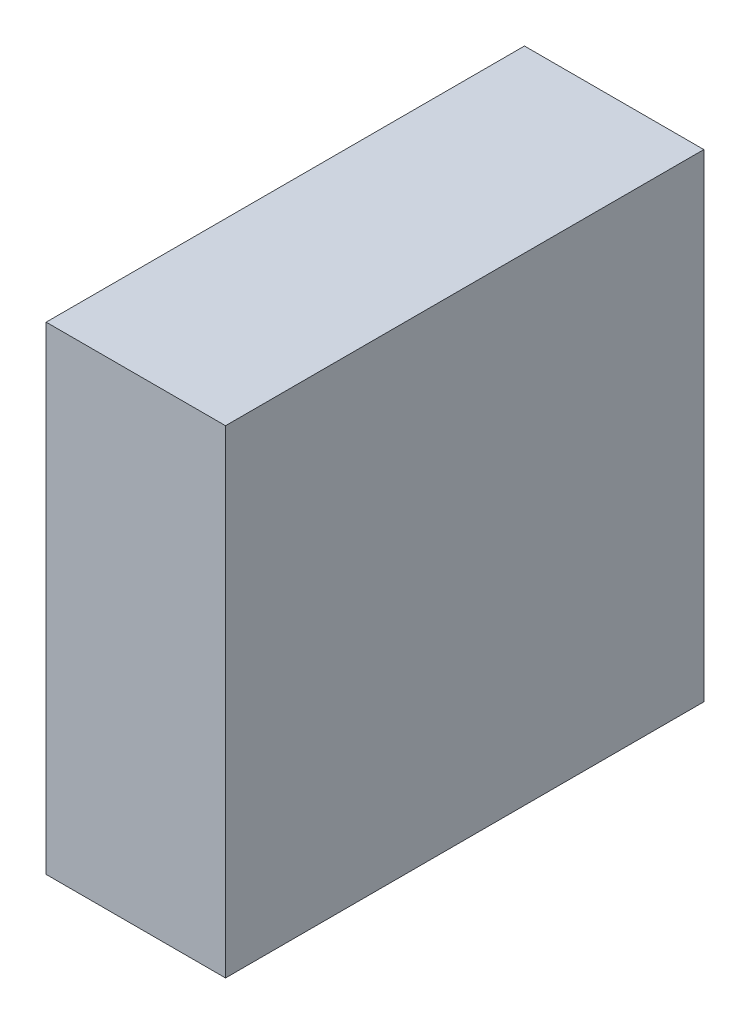
ISO-10303-21;
HEADER;
FILE_DESCRIPTION(('STEP AP214'),'2;1');
FILE_NAME('part.step','',(''),(''),'','','');
FILE_SCHEMA(('AUTOMOTIVE_DESIGN { 1 0 10303 214 1 1 1 1 }'));
ENDSEC;
DATA;
#1=APPLICATION_CONTEXT('core data for automotive mechanical design processes');
#2=APPLICATION_PROTOCOL_DEFINITION('international standard','automotive_design',2000,#1);
#3=PRODUCT_CONTEXT('',#1,'mechanical');
#4=PRODUCT('Part','Part','',(#3));
#5=PRODUCT_RELATED_PRODUCT_CATEGORY('part','',(#4));
#6=PRODUCT_DEFINITION_FORMATION('','',#4);
#7=PRODUCT_DEFINITION_CONTEXT('part definition',#1,'design');
#8=PRODUCT_DEFINITION('design','',#6,#7);
#9=PRODUCT_DEFINITION_SHAPE('','',#8);
#10=(LENGTH_UNIT() NAMED_UNIT(*) SI_UNIT(.MILLI.,.METRE.));
#11=(NAMED_UNIT(*) PLANE_ANGLE_UNIT() SI_UNIT($,.RADIAN.));
#12=(NAMED_UNIT(*) SI_UNIT($,.STERADIAN.) SOLID_ANGLE_UNIT());
#13=UNCERTAINTY_MEASURE_WITH_UNIT(LENGTH_MEASURE(1.E-05),#10,'distance_accuracy_value','');
#14=(GEOMETRIC_REPRESENTATION_CONTEXT(3) GLOBAL_UNCERTAINTY_ASSIGNED_CONTEXT((#13)) GLOBAL_UNIT_ASSIGNED_CONTEXT((#10,
#11,#12)) REPRESENTATION_CONTEXT('',''));
#15=CARTESIAN_POINT('',(0.,0.,0.));
#16=DIRECTION('',(0.,0.,1.));
#17=DIRECTION('',(1.,0.,0.));
#18=AXIS2_PLACEMENT_3D('',#15,#16,#17);
#19=CARTESIAN_POINT('',(0.,25.4,0.));
#20=DIRECTION('',(0.,0.,-1.));
#21=DIRECTION('',(-1.,0.,0.));
#22=AXIS2_PLACEMENT_3D('',#19,#20,#21);
#23=PLANE('',#22);
#24=DIRECTION('',(1.,0.,0.));
#25=VECTOR('',#24,1.);
#26=CARTESIAN_POINT('',(0.,0.,0.));
#27=LINE('',#26,#25);
#28=CARTESIAN_POINT('',(0.,0.,0.));
#29=VERTEX_POINT('',#28);
#30=CARTESIAN_POINT('',(9.525,0.,0.));
#31=VERTEX_POINT('',#30);
#32=EDGE_CURVE('E98',#29,#31,#27,.T.);
#33=ORIENTED_EDGE('',*,*,#32,.T.);
#34=DIRECTION('',(0.,-1.,0.));
#35=VECTOR('',#34,1.);
#36=CARTESIAN_POINT('',(9.525,25.4,0.));
#37=LINE('',#36,#35);
#38=CARTESIAN_POINT('',(9.525,25.4,0.));
#39=VERTEX_POINT('',#38);
#40=EDGE_CURVE('E11',#39,#31,#37,.T.);
#41=ORIENTED_EDGE('',*,*,#40,.F.);
#42=DIRECTION('',(1.,0.,0.));
#43=VECTOR('',#42,1.);
#44=CARTESIAN_POINT('',(0.,25.4,0.));
#45=LINE('',#44,#43);
#46=CARTESIAN_POINT('',(0.,25.4,0.));
#47=VERTEX_POINT('',#46);
#48=EDGE_CURVE('E84',#47,#39,#45,.T.);
#49=ORIENTED_EDGE('',*,*,#48,.F.);
#50=DIRECTION('',(0.,-1.,0.));
#51=VECTOR('',#50,1.);
#52=CARTESIAN_POINT('',(0.,25.4,0.));
#53=LINE('',#52,#51);
#54=EDGE_CURVE('E51',#47,#29,#53,.T.);
#55=ORIENTED_EDGE('',*,*,#54,.T.);
#56=EDGE_LOOP('',(#33,#41,#49,#55));
#57=FACE_BOUND('',#56,.T.);
#58=ADVANCED_FACE('F35',(#57),#23,.F.);
#59=CARTESIAN_POINT('',(9.525,25.4,0.));
#60=DIRECTION('',(-1.,0.,0.));
#61=DIRECTION('',(0.,0.,1.));
#62=AXIS2_PLACEMENT_3D('',#59,#60,#61);
#63=PLANE('',#62);
#64=DIRECTION('',(0.,0.,-1.));
#65=VECTOR('',#64,1.);
#66=CARTESIAN_POINT('',(9.525,0.,0.));
#67=LINE('',#66,#65);
#68=CARTESIAN_POINT('',(9.525,0.,-25.4));
#69=VERTEX_POINT('',#68);
#70=EDGE_CURVE('E89',#31,#69,#67,.T.);
#71=ORIENTED_EDGE('',*,*,#70,.T.);
#72=DIRECTION('',(0.,-1.,0.));
#73=VECTOR('',#72,1.);
#74=CARTESIAN_POINT('',(9.525,25.4,-25.4));
#75=LINE('',#74,#73);
#76=CARTESIAN_POINT('',(9.525,25.4,-25.4));
#77=VERTEX_POINT('',#76);
#78=EDGE_CURVE('E43',#77,#69,#75,.T.);
#79=ORIENTED_EDGE('',*,*,#78,.F.);
#80=DIRECTION('',(0.,0.,-1.));
#81=VECTOR('',#80,1.);
#82=CARTESIAN_POINT('',(9.525,25.4,0.));
#83=LINE('',#82,#81);
#84=EDGE_CURVE('E76',#39,#77,#83,.T.);
#85=ORIENTED_EDGE('',*,*,#84,.F.);
#86=ORIENTED_EDGE('',*,*,#40,.T.);
#87=EDGE_LOOP('',(#71,#79,#85,#86));
#88=FACE_BOUND('',#87,.T.);
#89=ADVANCED_FACE('F88',(#88),#63,.F.);
#90=CARTESIAN_POINT('',(0.,25.4,-25.4));
#91=DIRECTION('',(0.,0.,-1.));
#92=DIRECTION('',(-1.,0.,0.));
#93=AXIS2_PLACEMENT_3D('',#90,#91,#92);
#94=PLANE('',#93);
#95=DIRECTION('',(1.,0.,0.));
#96=VECTOR('',#95,1.);
#97=CARTESIAN_POINT('',(0.,0.,-25.4));
#98=LINE('',#97,#96);
#99=CARTESIAN_POINT('',(0.,0.,-25.4));
#100=VERTEX_POINT('',#99);
#101=EDGE_CURVE('E102',#100,#69,#98,.T.);
#102=ORIENTED_EDGE('',*,*,#101,.F.);
#103=DIRECTION('',(0.,-1.,0.));
#104=VECTOR('',#103,1.);
#105=CARTESIAN_POINT('',(0.,25.4,-25.4));
#106=LINE('',#105,#104);
#107=CARTESIAN_POINT('',(0.,25.4,-25.4));
#108=VERTEX_POINT('',#107);
#109=EDGE_CURVE('E65',#108,#100,#106,.T.);
#110=ORIENTED_EDGE('',*,*,#109,.F.);
#111=DIRECTION('',(1.,0.,0.));
#112=VECTOR('',#111,1.);
#113=CARTESIAN_POINT('',(0.,25.4,-25.4));
#114=LINE('',#113,#112);
#115=EDGE_CURVE('E83',#108,#77,#114,.T.);
#116=ORIENTED_EDGE('',*,*,#115,.T.);
#117=ORIENTED_EDGE('',*,*,#78,.T.);
#118=EDGE_LOOP('',(#102,#110,#116,#117));
#119=FACE_BOUND('',#118,.T.);
#120=ADVANCED_FACE('F92',(#119),#94,.T.);
#121=CARTESIAN_POINT('',(0.,25.4,0.));
#122=DIRECTION('',(-1.,0.,0.));
#123=DIRECTION('',(0.,0.,1.));
#124=AXIS2_PLACEMENT_3D('',#121,#122,#123);
#125=PLANE('',#124);
#126=DIRECTION('',(0.,0.,-1.));
#127=VECTOR('',#126,1.);
#128=CARTESIAN_POINT('',(0.,0.,0.));
#129=LINE('',#128,#127);
#130=EDGE_CURVE('E104',#29,#100,#129,.T.);
#131=ORIENTED_EDGE('',*,*,#130,.F.);
#132=ORIENTED_EDGE('',*,*,#54,.F.);
#133=DIRECTION('',(0.,0.,-1.));
#134=VECTOR('',#133,1.);
#135=CARTESIAN_POINT('',(0.,25.4,0.));
#136=LINE('',#135,#134);
#137=EDGE_CURVE('E93',#47,#108,#136,.T.);
#138=ORIENTED_EDGE('',*,*,#137,.T.);
#139=ORIENTED_EDGE('',*,*,#109,.T.);
#140=EDGE_LOOP('',(#131,#132,#138,#139));
#141=FACE_BOUND('',#140,.T.);
#142=ADVANCED_FACE('F137',(#141),#125,.T.);
#143=CARTESIAN_POINT('',(0.,25.4,0.));
#144=DIRECTION('',(0.,1.,0.));
#145=DIRECTION('',(0.,0.,1.));
#146=AXIS2_PLACEMENT_3D('',#143,#144,#145);
#147=PLANE('',#146);
#148=ORIENTED_EDGE('',*,*,#48,.T.);
#149=ORIENTED_EDGE('',*,*,#84,.T.);
#150=ORIENTED_EDGE('',*,*,#115,.F.);
#151=ORIENTED_EDGE('',*,*,#137,.F.);
#152=EDGE_LOOP('',(#148,#149,#150,#151));
#153=FACE_BOUND('',#152,.T.);
#154=ADVANCED_FACE('F80',(#153),#147,.T.);
#155=CARTESIAN_POINT('',(0.,0.,0.));
#156=DIRECTION('',(0.,1.,0.));
#157=DIRECTION('',(0.,0.,1.));
#158=AXIS2_PLACEMENT_3D('',#155,#156,#157);
#159=PLANE('',#158);
#160=CARTESIAN_POINT('',(4.7625,0.,-6.35));
#161=DIRECTION('',(0.,-1.,0.));
#162=DIRECTION('',(0.,0.,-1.));
#163=AXIS2_PLACEMENT_3D('',#160,#161,#162);
#164=CIRCLE('',#163,1.5875);
#165=CARTESIAN_POINT('',(4.7625,0.,-7.9375));
#166=VERTEX_POINT('',#165);
#167=EDGE_CURVE('E116',#166,#166,#164,.T.);
#168=ORIENTED_EDGE('',*,*,#167,.F.);
#169=EDGE_LOOP('',(#168));
#170=FACE_BOUND('',#169,.T.);
#171=CARTESIAN_POINT('',(4.7625,0.,-19.05));
#172=DIRECTION('',(0.,-1.,0.));
#173=DIRECTION('',(0.,0.,-1.));
#174=AXIS2_PLACEMENT_3D('',#171,#172,#173);
#175=CIRCLE('',#174,1.5875);
#176=CARTESIAN_POINT('',(4.7625,0.,-20.6375));
#177=VERTEX_POINT('',#176);
#178=EDGE_CURVE('E110',#177,#177,#175,.T.);
#179=ORIENTED_EDGE('',*,*,#178,.F.);
#180=EDGE_LOOP('',(#179));
#181=FACE_BOUND('',#180,.T.);
#182=ORIENTED_EDGE('',*,*,#32,.F.);
#183=ORIENTED_EDGE('',*,*,#130,.T.);
#184=ORIENTED_EDGE('',*,*,#101,.T.);
#185=ORIENTED_EDGE('',*,*,#70,.F.);
#186=EDGE_LOOP('',(#182,#183,#184,#185));
#187=FACE_BOUND('',#186,.T.);
#188=ADVANCED_FACE('F131',(#170,#181,#187),#159,.F.);
#189=CARTESIAN_POINT('',(4.7625,9.525,-19.05));
#190=DIRECTION('',(0.,-1.,0.));
#191=DIRECTION('',(0.,0.,-1.));
#192=AXIS2_PLACEMENT_3D('',#189,#190,#191);
#193=CYLINDRICAL_SURFACE('',#192,1.5875);
#194=CARTESIAN_POINT('',(4.7625,9.525,-19.05));
#195=DIRECTION('',(0.,-1.,0.));
#196=DIRECTION('',(0.,0.,-1.));
#197=AXIS2_PLACEMENT_3D('',#194,#195,#196);
#198=CIRCLE('',#197,1.5875);
#199=CARTESIAN_POINT('',(4.7625,9.525,-20.6375));
#200=VERTEX_POINT('',#199);
#201=EDGE_CURVE('E100',#200,#200,#198,.T.);
#202=CARTESIAN_POINT('',(4.7625,9.525,-20.6375));
#203=CARTESIAN_POINT('',(4.7625,9.42578125,-20.6375));
#204=CARTESIAN_POINT('',(4.7625,9.3265625,-20.6375));
#205=CARTESIAN_POINT('',(4.7625,9.128125,-20.6375));
#206=CARTESIAN_POINT('',(4.7625,9.02890625,-20.6375));
#207=CARTESIAN_POINT('',(4.7625,8.83046875,-20.6375));
#208=CARTESIAN_POINT('',(4.7625,8.73125,-20.6375));
#209=CARTESIAN_POINT('',(4.7625,8.5328125,-20.6375));
#210=CARTESIAN_POINT('',(4.7625,8.43359375,-20.6375));
#211=CARTESIAN_POINT('',(4.7625,8.23515625,-20.6375));
#212=CARTESIAN_POINT('',(4.7625,8.1359375,-20.6375));
#213=CARTESIAN_POINT('',(4.7625,7.9375,-20.6375));
#214=CARTESIAN_POINT('',(4.7625,7.83828125,-20.6375));
#215=CARTESIAN_POINT('',(4.7625,7.63984375,-20.6375));
#216=CARTESIAN_POINT('',(4.7625,7.540625,-20.6375));
#217=CARTESIAN_POINT('',(4.7625,7.3421875,-20.6375));
#218=CARTESIAN_POINT('',(4.7625,7.24296875,-20.6375));
#219=CARTESIAN_POINT('',(4.7625,7.04453125,-20.6375));
#220=CARTESIAN_POINT('',(4.7625,6.9453125,-20.6375));
#221=CARTESIAN_POINT('',(4.7625,6.746875,-20.6375));
#222=CARTESIAN_POINT('',(4.7625,6.64765625,-20.6375));
#223=CARTESIAN_POINT('',(4.7625,6.44921875,-20.6375));
#224=CARTESIAN_POINT('',(4.7625,6.35,-20.6375));
#225=CARTESIAN_POINT('',(4.7625,6.1515625,-20.6375));
#226=CARTESIAN_POINT('',(4.7625,6.05234375,-20.6375));
#227=CARTESIAN_POINT('',(4.7625,5.85390625,-20.6375));
#228=CARTESIAN_POINT('',(4.7625,5.7546875,-20.6375));
#229=CARTESIAN_POINT('',(4.7625,5.55625,-20.6375));
#230=CARTESIAN_POINT('',(4.7625,5.45703125,-20.6375));
#231=CARTESIAN_POINT('',(4.7625,5.25859375,-20.6375));
#232=CARTESIAN_POINT('',(4.7625,5.159375,-20.6375));
#233=CARTESIAN_POINT('',(4.7625,4.9609375,-20.6375));
#234=CARTESIAN_POINT('',(4.7625,4.86171875,-20.6375));
#235=CARTESIAN_POINT('',(4.7625,4.66328125,-20.6375));
#236=CARTESIAN_POINT('',(4.7625,4.5640625,-20.6375));
#237=CARTESIAN_POINT('',(4.7625,4.365625,-20.6375));
#238=CARTESIAN_POINT('',(4.7625,4.26640625,-20.6375));
#239=CARTESIAN_POINT('',(4.7625,4.06796875,-20.6375));
#240=CARTESIAN_POINT('',(4.7625,3.96875,-20.6375));
#241=CARTESIAN_POINT('',(4.7625,3.7703125,-20.6375));
#242=CARTESIAN_POINT('',(4.7625,3.67109375,-20.6375));
#243=CARTESIAN_POINT('',(4.7625,3.47265625,-20.6375));
#244=CARTESIAN_POINT('',(4.7625,3.3734375,-20.6375));
#245=CARTESIAN_POINT('',(4.7625,3.175,-20.6375));
#246=CARTESIAN_POINT('',(4.7625,3.07578125,-20.6375));
#247=CARTESIAN_POINT('',(4.7625,2.87734375,-20.6375));
#248=CARTESIAN_POINT('',(4.7625,2.778125,-20.6375));
#249=CARTESIAN_POINT('',(4.7625,2.5796875,-20.6375));
#250=CARTESIAN_POINT('',(4.7625,2.48046875,-20.6375));
#251=CARTESIAN_POINT('',(4.7625,2.28203125,-20.6375));
#252=CARTESIAN_POINT('',(4.7625,2.1828125,-20.6375));
#253=CARTESIAN_POINT('',(4.7625,1.984375,-20.6375));
#254=CARTESIAN_POINT('',(4.7625,1.88515625,-20.6375));
#255=CARTESIAN_POINT('',(4.7625,1.68671875,-20.6375));
#256=CARTESIAN_POINT('',(4.7625,1.5875,-20.6375));
#257=CARTESIAN_POINT('',(4.7625,1.3890625,-20.6375));
#258=CARTESIAN_POINT('',(4.7625,1.28984375,-20.6375));
#259=CARTESIAN_POINT('',(4.7625,1.09140625,-20.6375));
#260=CARTESIAN_POINT('',(4.7625,0.992187500000001,-20.6375));
#261=CARTESIAN_POINT('',(4.7625,0.793750000000001,-20.6375));
#262=CARTESIAN_POINT('',(4.7625,0.69453125,-20.6375));
#263=CARTESIAN_POINT('',(4.7625,0.49609375,-20.6375));
#264=CARTESIAN_POINT('',(4.7625,0.396875,-20.6375));
#265=CARTESIAN_POINT('',(4.7625,0.1984375,-20.6375));
#266=CARTESIAN_POINT('',(4.7625,0.0992187500000001,-20.6375));
#267=CARTESIAN_POINT('',(4.7625,0.,-20.6375));
#268=B_SPLINE_CURVE_WITH_KNOTS('',3,(#202,#203,#204,#205,#206,#207,#208,#209,#210,#211,#212,
#213,#214,#215,#216,#217,#218,#219,#220,#221,#222,#223,#224,#225,#226,#227,#228,#229,#230,#231,
#232,#233,#234,#235,#236,#237,#238,#239,#240,#241,#242,#243,#244,#245,#246,#247,#248,#249,#250,
#251,#252,#253,#254,#255,#256,#257,#258,#259,#260,#261,#262,#263,#264,#265,#266,#267),
.UNSPECIFIED.,.F.,.F.,(4,2,2,2,2,2,2,2,2,2,2,2,2,2,2,2,2,2,2,2,2,2,2,2,2,2,2,2,2,2,2,2,4),(0.,
0.29765625,0.5953125,0.892968750000001,1.190625,1.48828125,1.7859375,2.08359375,2.38125,
2.67890625,2.9765625,3.27421875,3.571875,3.86953125,4.1671875,4.46484375,4.7625,5.06015625,
5.3578125,5.65546875,5.953125,6.25078125,6.5484375,6.84609375,7.14375,7.44140625,7.7390625,
8.03671875,8.334375,8.63203125,8.9296875,9.22734375,9.525),.UNSPECIFIED.);
#269=EDGE_CURVE('BSEAM134',#200,#177,#268,.T.);
#270=ORIENTED_EDGE('',*,*,#201,.F.);
#271=ORIENTED_EDGE('',*,*,#178,.T.);
#272=ORIENTED_EDGE('',*,*,#269,.T.);
#273=ORIENTED_EDGE('',*,*,#269,.F.);
#274=EDGE_LOOP('',(#270,#272,#271,#273));
#275=FACE_BOUND('',#274,.T.);
#276=ADVANCED_FACE('F134',(#275),#193,.F.);
#277=CARTESIAN_POINT('',(0.,9.525,0.));
#278=DIRECTION('',(0.,-1.,0.));
#279=DIRECTION('',(0.,0.,-1.));
#280=AXIS2_PLACEMENT_3D('',#277,#278,#279);
#281=PLANE('',#280);
#282=ORIENTED_EDGE('',*,*,#201,.T.);
#283=EDGE_LOOP('',(#282));
#284=FACE_BOUND('',#283,.T.);
#285=ADVANCED_FACE('F127',(#284),#281,.T.);
#286=CARTESIAN_POINT('',(4.7625,9.525,-6.35));
#287=DIRECTION('',(0.,-1.,0.));
#288=DIRECTION('',(0.,0.,-1.));
#289=AXIS2_PLACEMENT_3D('',#286,#287,#288);
#290=CYLINDRICAL_SURFACE('',#289,1.5875);
#291=CARTESIAN_POINT('',(4.7625,9.525,-6.35));
#292=DIRECTION('',(0.,-1.,0.));
#293=DIRECTION('',(0.,0.,-1.));
#294=AXIS2_PLACEMENT_3D('',#291,#292,#293);
#295=CIRCLE('',#294,1.5875);
#296=CARTESIAN_POINT('',(4.7625,9.525,-7.9375));
#297=VERTEX_POINT('',#296);
#298=EDGE_CURVE('E113',#297,#297,#295,.T.);
#299=CARTESIAN_POINT('',(4.7625,9.525,-7.9375));
#300=CARTESIAN_POINT('',(4.7625,9.42578125,-7.9375));
#301=CARTESIAN_POINT('',(4.7625,9.3265625,-7.9375));
#302=CARTESIAN_POINT('',(4.7625,9.128125,-7.9375));
#303=CARTESIAN_POINT('',(4.7625,9.02890625,-7.9375));
#304=CARTESIAN_POINT('',(4.7625,8.83046875,-7.9375));
#305=CARTESIAN_POINT('',(4.7625,8.73125,-7.9375));
#306=CARTESIAN_POINT('',(4.7625,8.5328125,-7.9375));
#307=CARTESIAN_POINT('',(4.7625,8.43359375,-7.9375));
#308=CARTESIAN_POINT('',(4.7625,8.23515625,-7.9375));
#309=CARTESIAN_POINT('',(4.7625,8.1359375,-7.9375));
#310=CARTESIAN_POINT('',(4.7625,7.9375,-7.9375));
#311=CARTESIAN_POINT('',(4.7625,7.83828125,-7.9375));
#312=CARTESIAN_POINT('',(4.7625,7.63984375,-7.9375));
#313=CARTESIAN_POINT('',(4.7625,7.540625,-7.9375));
#314=CARTESIAN_POINT('',(4.7625,7.3421875,-7.9375));
#315=CARTESIAN_POINT('',(4.7625,7.24296875,-7.9375));
#316=CARTESIAN_POINT('',(4.7625,7.04453125,-7.9375));
#317=CARTESIAN_POINT('',(4.7625,6.9453125,-7.9375));
#318=CARTESIAN_POINT('',(4.7625,6.746875,-7.9375));
#319=CARTESIAN_POINT('',(4.7625,6.64765625,-7.9375));
#320=CARTESIAN_POINT('',(4.7625,6.44921875,-7.9375));
#321=CARTESIAN_POINT('',(4.7625,6.35,-7.9375));
#322=CARTESIAN_POINT('',(4.7625,6.1515625,-7.9375));
#323=CARTESIAN_POINT('',(4.7625,6.05234375,-7.9375));
#324=CARTESIAN_POINT('',(4.7625,5.85390625,-7.9375));
#325=CARTESIAN_POINT('',(4.7625,5.7546875,-7.9375));
#326=CARTESIAN_POINT('',(4.7625,5.55625,-7.9375));
#327=CARTESIAN_POINT('',(4.7625,5.45703125,-7.9375));
#328=CARTESIAN_POINT('',(4.7625,5.25859375,-7.9375));
#329=CARTESIAN_POINT('',(4.7625,5.159375,-7.9375));
#330=CARTESIAN_POINT('',(4.7625,4.9609375,-7.9375));
#331=CARTESIAN_POINT('',(4.7625,4.86171875,-7.9375));
#332=CARTESIAN_POINT('',(4.7625,4.66328125,-7.9375));
#333=CARTESIAN_POINT('',(4.7625,4.5640625,-7.9375));
#334=CARTESIAN_POINT('',(4.7625,4.365625,-7.9375));
#335=CARTESIAN_POINT('',(4.7625,4.26640625,-7.9375));
#336=CARTESIAN_POINT('',(4.7625,4.06796875,-7.9375));
#337=CARTESIAN_POINT('',(4.7625,3.96875,-7.9375));
#338=CARTESIAN_POINT('',(4.7625,3.7703125,-7.9375));
#339=CARTESIAN_POINT('',(4.7625,3.67109375,-7.9375));
#340=CARTESIAN_POINT('',(4.7625,3.47265625,-7.9375));
#341=CARTESIAN_POINT('',(4.7625,3.3734375,-7.9375));
#342=CARTESIAN_POINT('',(4.7625,3.175,-7.9375));
#343=CARTESIAN_POINT('',(4.7625,3.07578125,-7.9375));
#344=CARTESIAN_POINT('',(4.7625,2.87734375,-7.9375));
#345=CARTESIAN_POINT('',(4.7625,2.778125,-7.9375));
#346=CARTESIAN_POINT('',(4.7625,2.5796875,-7.9375));
#347=CARTESIAN_POINT('',(4.7625,2.48046875,-7.9375));
#348=CARTESIAN_POINT('',(4.7625,2.28203125,-7.9375));
#349=CARTESIAN_POINT('',(4.7625,2.1828125,-7.9375));
#350=CARTESIAN_POINT('',(4.7625,1.984375,-7.9375));
#351=CARTESIAN_POINT('',(4.7625,1.88515625,-7.9375));
#352=CARTESIAN_POINT('',(4.7625,1.68671875,-7.9375));
#353=CARTESIAN_POINT('',(4.7625,1.5875,-7.9375));
#354=CARTESIAN_POINT('',(4.7625,1.3890625,-7.9375));
#355=CARTESIAN_POINT('',(4.7625,1.28984375,-7.9375));
#356=CARTESIAN_POINT('',(4.7625,1.09140625,-7.9375));
#357=CARTESIAN_POINT('',(4.7625,0.992187500000001,-7.9375));
#358=CARTESIAN_POINT('',(4.7625,0.793750000000001,-7.9375));
#359=CARTESIAN_POINT('',(4.7625,0.69453125,-7.9375));
#360=CARTESIAN_POINT('',(4.7625,0.49609375,-7.9375));
#361=CARTESIAN_POINT('',(4.7625,0.396875,-7.9375));
#362=CARTESIAN_POINT('',(4.7625,0.1984375,-7.9375));
#363=CARTESIAN_POINT('',(4.7625,0.0992187500000001,-7.9375));
#364=CARTESIAN_POINT('',(4.7625,0.,-7.9375));
#365=B_SPLINE_CURVE_WITH_KNOTS('',3,(#299,#300,#301,#302,#303,#304,#305,#306,#307,#308,#309,
#310,#311,#312,#313,#314,#315,#316,#317,#318,#319,#320,#321,#322,#323,#324,#325,#326,#327,#328,
#329,#330,#331,#332,#333,#334,#335,#336,#337,#338,#339,#340,#341,#342,#343,#344,#345,#346,#347,
#348,#349,#350,#351,#352,#353,#354,#355,#356,#357,#358,#359,#360,#361,#362,#363,#364),
.UNSPECIFIED.,.F.,.F.,(4,2,2,2,2,2,2,2,2,2,2,2,2,2,2,2,2,2,2,2,2,2,2,2,2,2,2,2,2,2,2,2,4),(0.,
0.29765625,0.5953125,0.892968750000001,1.190625,1.48828125,1.7859375,2.08359375,2.38125,
2.67890625,2.9765625,3.27421875,3.571875,3.86953125,4.1671875,4.46484375,4.7625,5.06015625,
5.3578125,5.65546875,5.953125,6.25078125,6.5484375,6.84609375,7.14375,7.44140625,7.7390625,
8.03671875,8.334375,8.63203125,8.9296875,9.22734375,9.525),.UNSPECIFIED.);
#366=EDGE_CURVE('BSEAM124',#297,#166,#365,.T.);
#367=ORIENTED_EDGE('',*,*,#298,.F.);
#368=ORIENTED_EDGE('',*,*,#167,.T.);
#369=ORIENTED_EDGE('',*,*,#366,.T.);
#370=ORIENTED_EDGE('',*,*,#366,.F.);
#371=EDGE_LOOP('',(#367,#369,#368,#370));
#372=FACE_BOUND('',#371,.T.);
#373=ADVANCED_FACE('F124',(#372),#290,.F.);
#374=CARTESIAN_POINT('',(0.,9.525,0.));
#375=DIRECTION('',(0.,-1.,0.));
#376=DIRECTION('',(0.,0.,-1.));
#377=AXIS2_PLACEMENT_3D('',#374,#375,#376);
#378=PLANE('',#377);
#379=ORIENTED_EDGE('',*,*,#298,.T.);
#380=EDGE_LOOP('',(#379));
#381=FACE_BOUND('',#380,.T.);
#382=ADVANCED_FACE('F122',(#381),#378,.T.);
#383=CLOSED_SHELL('',(#58,#89,#120,#142,#154,#188,#276,#285,#373,#382));
#384=MANIFOLD_SOLID_BREP('B2',#383);
#385=ADVANCED_BREP_SHAPE_REPRESENTATION('',(#18,#384),#14);
#386=SHAPE_DEFINITION_REPRESENTATION(#9,#385);
ENDSEC;
END-ISO-10303-21;
